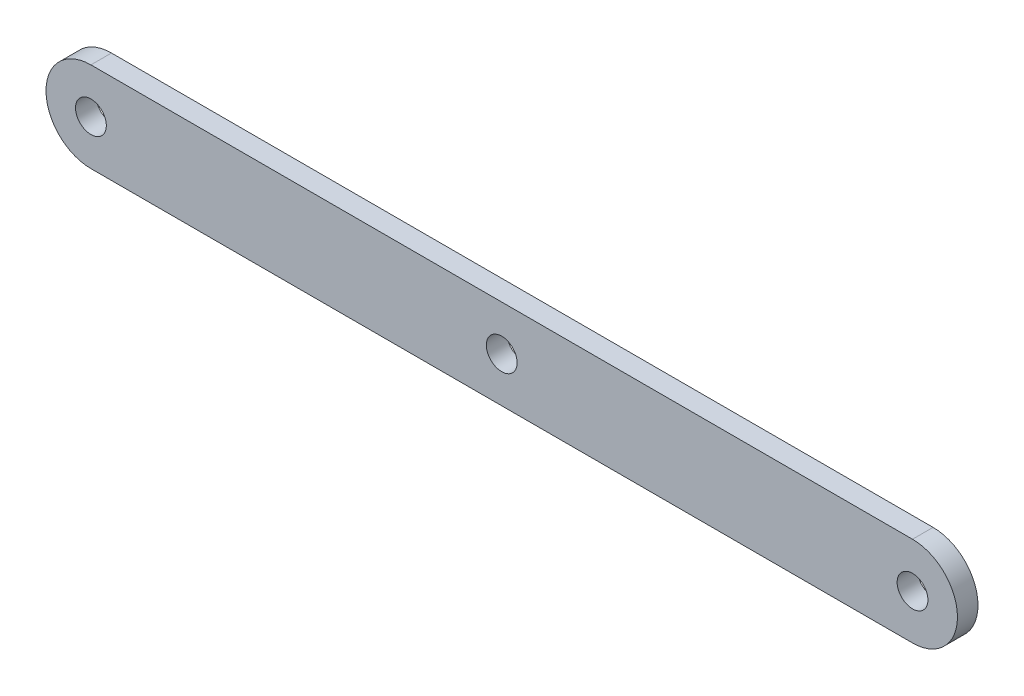
ISO-10303-21;
HEADER;
FILE_DESCRIPTION(('STEP AP214'),'2;1');
FILE_NAME('part.step','',(''),(''),'','','');
FILE_SCHEMA(('AUTOMOTIVE_DESIGN { 1 0 10303 214 1 1 1 1 }'));
ENDSEC;
DATA;
#1=APPLICATION_CONTEXT('core data for automotive mechanical design processes');
#2=APPLICATION_PROTOCOL_DEFINITION('international standard','automotive_design',2000,#1);
#3=PRODUCT_CONTEXT('',#1,'mechanical');
#4=PRODUCT('Part','Part','',(#3));
#5=PRODUCT_RELATED_PRODUCT_CATEGORY('part','',(#4));
#6=PRODUCT_DEFINITION_FORMATION('','',#4);
#7=PRODUCT_DEFINITION_CONTEXT('part definition',#1,'design');
#8=PRODUCT_DEFINITION('design','',#6,#7);
#9=PRODUCT_DEFINITION_SHAPE('','',#8);
#10=(LENGTH_UNIT() NAMED_UNIT(*) SI_UNIT(.MILLI.,.METRE.));
#11=(NAMED_UNIT(*) PLANE_ANGLE_UNIT() SI_UNIT($,.RADIAN.));
#12=(NAMED_UNIT(*) SI_UNIT($,.STERADIAN.) SOLID_ANGLE_UNIT());
#13=UNCERTAINTY_MEASURE_WITH_UNIT(LENGTH_MEASURE(1.E-05),#10,'distance_accuracy_value','');
#14=(GEOMETRIC_REPRESENTATION_CONTEXT(3) GLOBAL_UNCERTAINTY_ASSIGNED_CONTEXT((#13)) GLOBAL_UNIT_ASSIGNED_CONTEXT((#10,
#11,#12)) REPRESENTATION_CONTEXT('',''));
#15=CARTESIAN_POINT('',(0.,0.,0.));
#16=DIRECTION('',(0.,0.,1.));
#17=DIRECTION('',(1.,0.,0.));
#18=AXIS2_PLACEMENT_3D('',#15,#16,#17);
#19=CARTESIAN_POINT('',(-93.5894948768944,-10.2823257960314,40.));
#20=DIRECTION('',(0.,0.,1.));
#21=DIRECTION('',(1.,0.,0.));
#22=AXIS2_PLACEMENT_3D('',#19,#20,#21);
#23=PLANE('',#22);
#24=CARTESIAN_POINT('',(1506.41050512311,-10.2823257960314,40.));
#25=DIRECTION('',(0.,0.,1.));
#26=DIRECTION('',(1.,0.,0.));
#27=AXIS2_PLACEMENT_3D('',#24,#25,#26);
#28=CIRCLE('',#27,30.);
#29=CARTESIAN_POINT('',(1536.41050512311,-10.2823257960314,40.));
#30=VERTEX_POINT('',#29);
#31=EDGE_CURVE('E115',#30,#30,#28,.T.);
#32=ORIENTED_EDGE('',*,*,#31,.F.);
#33=EDGE_LOOP('',(#32));
#34=FACE_BOUND('',#33,.T.);
#35=CARTESIAN_POINT('',(-93.5894948768944,-10.2823257960314,40.));
#36=DIRECTION('',(0.,0.,1.));
#37=DIRECTION('',(1.,0.,0.));
#38=AXIS2_PLACEMENT_3D('',#35,#36,#37);
#39=CIRCLE('',#38,87.5);
#40=CARTESIAN_POINT('',(-93.5894948768944,77.2176742039686,40.));
#41=VERTEX_POINT('',#40);
#42=CARTESIAN_POINT('',(-93.5894948768944,-97.7823257960314,40.));
#43=VERTEX_POINT('',#42);
#44=EDGE_CURVE('E85',#41,#43,#39,.T.);
#45=ORIENTED_EDGE('',*,*,#44,.T.);
#46=DIRECTION('',(1.,0.,0.));
#47=VECTOR('',#46,1.);
#48=CARTESIAN_POINT('',(-93.5894948768944,-97.7823257960314,40.));
#49=LINE('',#48,#47);
#50=CARTESIAN_POINT('',(1506.41050512311,-97.7823257960314,40.));
#51=VERTEX_POINT('',#50);
#52=EDGE_CURVE('E80',#43,#51,#49,.T.);
#53=ORIENTED_EDGE('',*,*,#52,.T.);
#54=CARTESIAN_POINT('',(1506.41050512311,-10.2823257960314,40.));
#55=DIRECTION('',(0.,0.,1.));
#56=DIRECTION('',(1.,0.,0.));
#57=AXIS2_PLACEMENT_3D('',#54,#55,#56);
#58=CIRCLE('',#57,87.5);
#59=CARTESIAN_POINT('',(1506.41050512311,77.2176742039686,40.));
#60=VERTEX_POINT('',#59);
#61=EDGE_CURVE('E83',#51,#60,#58,.T.);
#62=ORIENTED_EDGE('',*,*,#61,.T.);
#63=DIRECTION('',(-1.,0.,0.));
#64=VECTOR('',#63,1.);
#65=CARTESIAN_POINT('',(-93.5894948768944,77.2176742039686,40.));
#66=LINE('',#65,#64);
#67=EDGE_CURVE('E50',#60,#41,#66,.T.);
#68=ORIENTED_EDGE('',*,*,#67,.T.);
#69=EDGE_LOOP('',(#45,#53,#62,#68));
#70=FACE_BOUND('',#69,.T.);
#71=CARTESIAN_POINT('',(-93.5894948768944,-10.2823257960314,40.));
#72=DIRECTION('',(0.,0.,1.));
#73=DIRECTION('',(1.,0.,0.));
#74=AXIS2_PLACEMENT_3D('',#71,#72,#73);
#75=CIRCLE('',#74,30.);
#76=CARTESIAN_POINT('',(-63.5894948768944,-10.2823257960314,40.));
#77=VERTEX_POINT('',#76);
#78=EDGE_CURVE('E100',#77,#77,#75,.T.);
#79=ORIENTED_EDGE('',*,*,#78,.F.);
#80=EDGE_LOOP('',(#79));
#81=FACE_BOUND('',#80,.T.);
#82=CARTESIAN_POINT('',(706.410505123106,-10.2823257960314,40.));
#83=DIRECTION('',(0.,0.,1.));
#84=DIRECTION('',(1.,0.,0.));
#85=AXIS2_PLACEMENT_3D('',#82,#83,#84);
#86=CIRCLE('',#85,29.9999999999999);
#87=CARTESIAN_POINT('',(736.410505123106,-10.2823257960314,40.));
#88=VERTEX_POINT('',#87);
#89=EDGE_CURVE('E121',#88,#88,#86,.T.);
#90=ORIENTED_EDGE('',*,*,#89,.F.);
#91=EDGE_LOOP('',(#90));
#92=FACE_BOUND('',#91,.T.);
#93=ADVANCED_FACE('F33',(#34,#70,#81,#92),#23,.T.);
#94=CARTESIAN_POINT('',(-93.5894948768944,-10.2823257960314,0.));
#95=DIRECTION('',(0.,0.,1.));
#96=DIRECTION('',(1.,0.,0.));
#97=AXIS2_PLACEMENT_3D('',#94,#95,#96);
#98=PLANE('',#97);
#99=CARTESIAN_POINT('',(1506.41050512311,-10.2823257960314,0.));
#100=DIRECTION('',(0.,0.,1.));
#101=DIRECTION('',(1.,0.,0.));
#102=AXIS2_PLACEMENT_3D('',#99,#100,#101);
#103=CIRCLE('',#102,30.);
#104=CARTESIAN_POINT('',(1536.41050512311,-10.2823257960314,0.));
#105=VERTEX_POINT('',#104);
#106=EDGE_CURVE('E118',#105,#105,#103,.T.);
#107=ORIENTED_EDGE('',*,*,#106,.T.);
#108=EDGE_LOOP('',(#107));
#109=FACE_BOUND('',#108,.T.);
#110=CARTESIAN_POINT('',(-93.5894948768944,-10.2823257960314,0.));
#111=DIRECTION('',(0.,0.,1.));
#112=DIRECTION('',(1.,0.,0.));
#113=AXIS2_PLACEMENT_3D('',#110,#111,#112);
#114=CIRCLE('',#113,87.5);
#115=CARTESIAN_POINT('',(-93.5894948768944,77.2176742039686,0.));
#116=VERTEX_POINT('',#115);
#117=CARTESIAN_POINT('',(-93.5894948768944,-97.7823257960314,0.));
#118=VERTEX_POINT('',#117);
#119=EDGE_CURVE('E97',#116,#118,#114,.T.);
#120=ORIENTED_EDGE('',*,*,#119,.F.);
#121=DIRECTION('',(-1.,0.,0.));
#122=VECTOR('',#121,1.);
#123=CARTESIAN_POINT('',(-93.5894948768944,77.2176742039686,0.));
#124=LINE('',#123,#122);
#125=CARTESIAN_POINT('',(1506.41050512311,77.2176742039686,0.));
#126=VERTEX_POINT('',#125);
#127=EDGE_CURVE('E73',#126,#116,#124,.T.);
#128=ORIENTED_EDGE('',*,*,#127,.F.);
#129=CARTESIAN_POINT('',(1506.41050512311,-10.2823257960314,0.));
#130=DIRECTION('',(0.,0.,1.));
#131=DIRECTION('',(1.,0.,0.));
#132=AXIS2_PLACEMENT_3D('',#129,#130,#131);
#133=CIRCLE('',#132,87.5);
#134=CARTESIAN_POINT('',(1506.41050512311,-97.7823257960314,0.));
#135=VERTEX_POINT('',#134);
#136=EDGE_CURVE('E67',#135,#126,#133,.T.);
#137=ORIENTED_EDGE('',*,*,#136,.F.);
#138=DIRECTION('',(1.,0.,0.));
#139=VECTOR('',#138,1.);
#140=CARTESIAN_POINT('',(-93.5894948768944,-97.7823257960314,0.));
#141=LINE('',#140,#139);
#142=EDGE_CURVE('E89',#118,#135,#141,.T.);
#143=ORIENTED_EDGE('',*,*,#142,.F.);
#144=EDGE_LOOP('',(#120,#128,#137,#143));
#145=FACE_BOUND('',#144,.T.);
#146=CARTESIAN_POINT('',(-93.5894948768944,-10.2823257960314,0.));
#147=DIRECTION('',(0.,0.,1.));
#148=DIRECTION('',(1.,0.,0.));
#149=AXIS2_PLACEMENT_3D('',#146,#147,#148);
#150=CIRCLE('',#149,30.);
#151=CARTESIAN_POINT('',(-63.5894948768944,-10.2823257960314,0.));
#152=VERTEX_POINT('',#151);
#153=EDGE_CURVE('E112',#152,#152,#150,.T.);
#154=ORIENTED_EDGE('',*,*,#153,.T.);
#155=EDGE_LOOP('',(#154));
#156=FACE_BOUND('',#155,.T.);
#157=CARTESIAN_POINT('',(706.410505123106,-10.2823257960314,0.));
#158=DIRECTION('',(0.,0.,1.));
#159=DIRECTION('',(1.,0.,0.));
#160=AXIS2_PLACEMENT_3D('',#157,#158,#159);
#161=CIRCLE('',#160,29.9999999999999);
#162=CARTESIAN_POINT('',(736.410505123106,-10.2823257960314,0.));
#163=VERTEX_POINT('',#162);
#164=EDGE_CURVE('E124',#163,#163,#161,.T.);
#165=ORIENTED_EDGE('',*,*,#164,.T.);
#166=EDGE_LOOP('',(#165));
#167=FACE_BOUND('',#166,.T.);
#168=ADVANCED_FACE('F108',(#109,#145,#156,#167),#98,.F.);
#169=CARTESIAN_POINT('',(-93.5894948768944,-10.2823257960314,40.));
#170=DIRECTION('',(0.,0.,-1.));
#171=DIRECTION('',(-1.,0.,0.));
#172=AXIS2_PLACEMENT_3D('',#169,#170,#171);
#173=CYLINDRICAL_SURFACE('',#172,87.5);
#174=ORIENTED_EDGE('',*,*,#119,.T.);
#175=DIRECTION('',(0.,0.,-1.));
#176=VECTOR('',#175,1.);
#177=CARTESIAN_POINT('',(-93.5894948768944,-97.7823257960314,40.));
#178=LINE('',#177,#176);
#179=EDGE_CURVE('E11',#43,#118,#178,.T.);
#180=ORIENTED_EDGE('',*,*,#179,.F.);
#181=ORIENTED_EDGE('',*,*,#44,.F.);
#182=DIRECTION('',(0.,0.,-1.));
#183=VECTOR('',#182,1.);
#184=CARTESIAN_POINT('',(-93.5894948768944,77.2176742039686,40.));
#185=LINE('',#184,#183);
#186=EDGE_CURVE('E93',#41,#116,#185,.T.);
#187=ORIENTED_EDGE('',*,*,#186,.T.);
#188=EDGE_LOOP('',(#174,#180,#181,#187));
#189=FACE_BOUND('',#188,.T.);
#190=ADVANCED_FACE('F35',(#189),#173,.T.);
#191=CARTESIAN_POINT('',(-93.5894948768944,-97.7823257960314,40.));
#192=DIRECTION('',(0.,1.,0.));
#193=DIRECTION('',(0.,0.,1.));
#194=AXIS2_PLACEMENT_3D('',#191,#192,#193);
#195=PLANE('',#194);
#196=ORIENTED_EDGE('',*,*,#142,.T.);
#197=DIRECTION('',(0.,0.,-1.));
#198=VECTOR('',#197,1.);
#199=CARTESIAN_POINT('',(1506.41050512311,-97.7823257960314,40.));
#200=LINE('',#199,#198);
#201=EDGE_CURVE('E42',#51,#135,#200,.T.);
#202=ORIENTED_EDGE('',*,*,#201,.F.);
#203=ORIENTED_EDGE('',*,*,#52,.F.);
#204=ORIENTED_EDGE('',*,*,#179,.T.);
#205=EDGE_LOOP('',(#196,#202,#203,#204));
#206=FACE_BOUND('',#205,.T.);
#207=ADVANCED_FACE('F88',(#206),#195,.F.);
#208=CARTESIAN_POINT('',(1506.41050512311,-10.2823257960314,40.));
#209=DIRECTION('',(0.,0.,-1.));
#210=DIRECTION('',(-1.,0.,0.));
#211=AXIS2_PLACEMENT_3D('',#208,#209,#210);
#212=CYLINDRICAL_SURFACE('',#211,87.5);
#213=ORIENTED_EDGE('',*,*,#136,.T.);
#214=DIRECTION('',(0.,0.,-1.));
#215=VECTOR('',#214,1.);
#216=CARTESIAN_POINT('',(1506.41050512311,77.2176742039686,40.));
#217=LINE('',#216,#215);
#218=EDGE_CURVE('E90',#60,#126,#217,.T.);
#219=ORIENTED_EDGE('',*,*,#218,.F.);
#220=ORIENTED_EDGE('',*,*,#61,.F.);
#221=ORIENTED_EDGE('',*,*,#201,.T.);
#222=EDGE_LOOP('',(#213,#219,#220,#221));
#223=FACE_BOUND('',#222,.T.);
#224=ADVANCED_FACE('F91',(#223),#212,.T.);
#225=CARTESIAN_POINT('',(-93.5894948768944,77.2176742039686,40.));
#226=DIRECTION('',(0.,-1.,0.));
#227=DIRECTION('',(0.,0.,-1.));
#228=AXIS2_PLACEMENT_3D('',#225,#226,#227);
#229=PLANE('',#228);
#230=ORIENTED_EDGE('',*,*,#127,.T.);
#231=ORIENTED_EDGE('',*,*,#186,.F.);
#232=ORIENTED_EDGE('',*,*,#67,.F.);
#233=ORIENTED_EDGE('',*,*,#218,.T.);
#234=EDGE_LOOP('',(#230,#231,#232,#233));
#235=FACE_BOUND('',#234,.T.);
#236=ADVANCED_FACE('F105',(#235),#229,.F.);
#237=CARTESIAN_POINT('',(-93.5894948768944,-10.2823257960314,40.));
#238=DIRECTION('',(0.,0.,-1.));
#239=DIRECTION('',(-1.,0.,0.));
#240=AXIS2_PLACEMENT_3D('',#237,#238,#239);
#241=CYLINDRICAL_SURFACE('',#240,30.);
#242=ORIENTED_EDGE('',*,*,#78,.T.);
#243=EDGE_LOOP('',(#242));
#244=FACE_BOUND('',#243,.T.);
#245=ORIENTED_EDGE('',*,*,#153,.F.);
#246=EDGE_LOOP('',(#245));
#247=FACE_BOUND('',#246,.T.);
#248=ADVANCED_FACE('F143',(#244,#247),#241,.F.);
#249=CARTESIAN_POINT('',(1506.41050512311,-10.2823257960314,40.));
#250=DIRECTION('',(0.,0.,-1.));
#251=DIRECTION('',(-1.,0.,0.));
#252=AXIS2_PLACEMENT_3D('',#249,#250,#251);
#253=CYLINDRICAL_SURFACE('',#252,30.);
#254=ORIENTED_EDGE('',*,*,#31,.T.);
#255=EDGE_LOOP('',(#254));
#256=FACE_BOUND('',#255,.T.);
#257=ORIENTED_EDGE('',*,*,#106,.F.);
#258=EDGE_LOOP('',(#257));
#259=FACE_BOUND('',#258,.T.);
#260=ADVANCED_FACE('F189',(#256,#259),#253,.F.);
#261=CARTESIAN_POINT('',(706.410505123106,-10.2823257960314,40.));
#262=DIRECTION('',(0.,0.,-1.));
#263=DIRECTION('',(-1.,0.,0.));
#264=AXIS2_PLACEMENT_3D('',#261,#262,#263);
#265=CYLINDRICAL_SURFACE('',#264,29.9999999999999);
#266=ORIENTED_EDGE('',*,*,#89,.T.);
#267=EDGE_LOOP('',(#266));
#268=FACE_BOUND('',#267,.T.);
#269=ORIENTED_EDGE('',*,*,#164,.F.);
#270=EDGE_LOOP('',(#269));
#271=FACE_BOUND('',#270,.T.);
#272=ADVANCED_FACE('F130',(#268,#271),#265,.F.);
#273=CLOSED_SHELL('',(#93,#168,#190,#207,#224,#236,#248,#260,#272));
#274=MANIFOLD_SOLID_BREP('B2',#273);
#275=ADVANCED_BREP_SHAPE_REPRESENTATION('',(#18,#274),#14);
#276=SHAPE_DEFINITION_REPRESENTATION(#9,#275);
ENDSEC;
END-ISO-10303-21;
